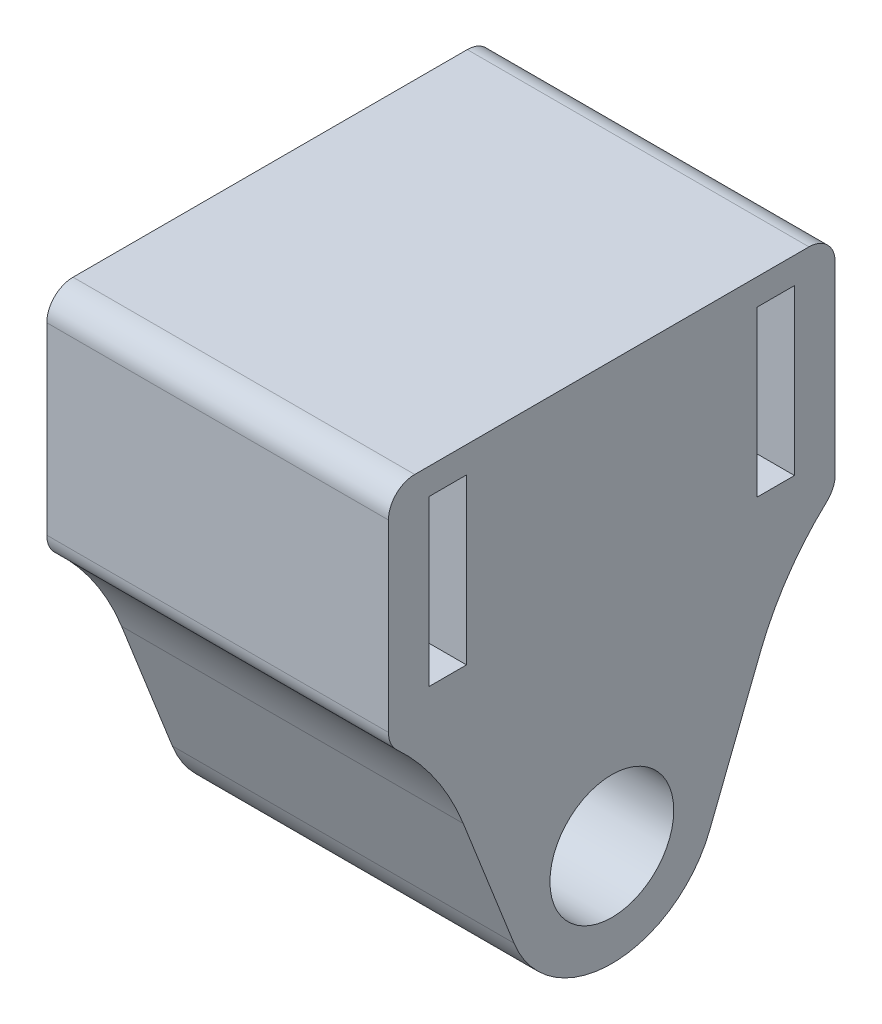
ISO-10303-21;
HEADER;
FILE_DESCRIPTION(('STEP AP214'),'2;1');
FILE_NAME('part.step','',(''),(''),'','','');
FILE_SCHEMA(('AUTOMOTIVE_DESIGN { 1 0 10303 214 1 1 1 1 }'));
ENDSEC;
DATA;
#1=APPLICATION_CONTEXT('core data for automotive mechanical design processes');
#2=APPLICATION_PROTOCOL_DEFINITION('international standard','automotive_design',2000,#1);
#3=PRODUCT_CONTEXT('',#1,'mechanical');
#4=PRODUCT('Part','Part','',(#3));
#5=PRODUCT_RELATED_PRODUCT_CATEGORY('part','',(#4));
#6=PRODUCT_DEFINITION_FORMATION('','',#4);
#7=PRODUCT_DEFINITION_CONTEXT('part definition',#1,'design');
#8=PRODUCT_DEFINITION('design','',#6,#7);
#9=PRODUCT_DEFINITION_SHAPE('','',#8);
#10=(LENGTH_UNIT() NAMED_UNIT(*) SI_UNIT(.MILLI.,.METRE.));
#11=(NAMED_UNIT(*) PLANE_ANGLE_UNIT() SI_UNIT($,.RADIAN.));
#12=(NAMED_UNIT(*) SI_UNIT($,.STERADIAN.) SOLID_ANGLE_UNIT());
#13=UNCERTAINTY_MEASURE_WITH_UNIT(LENGTH_MEASURE(1.E-05),#10,'distance_accuracy_value','');
#14=(GEOMETRIC_REPRESENTATION_CONTEXT(3) GLOBAL_UNCERTAINTY_ASSIGNED_CONTEXT((#13)) GLOBAL_UNIT_ASSIGNED_CONTEXT((#10,
#11,#12)) REPRESENTATION_CONTEXT('',''));
#15=CARTESIAN_POINT('',(0.,0.,0.));
#16=DIRECTION('',(0.,0.,1.));
#17=DIRECTION('',(1.,0.,0.));
#18=AXIS2_PLACEMENT_3D('',#15,#16,#17);
#19=CARTESIAN_POINT('',(-13.,7.935,8.5));
#20=DIRECTION('',(0.,0.,1.));
#21=DIRECTION('',(0.,-1.,0.));
#22=AXIS2_PLACEMENT_3D('',#19,#20,#21);
#23=PLANE('',#22);
#24=DIRECTION('',(0.,-1.,0.));
#25=VECTOR('',#24,1.);
#26=CARTESIAN_POINT('',(-13.,7.935,8.5));
#27=LINE('',#26,#25);
#28=CARTESIAN_POINT('',(-13.,6.935,8.5));
#29=VERTEX_POINT('',#28);
#30=CARTESIAN_POINT('',(-13.,-0.0649999999999956,8.5));
#31=VERTEX_POINT('',#30);
#32=EDGE_CURVE('E222',#29,#31,#27,.T.);
#33=ORIENTED_EDGE('',*,*,#32,.T.);
#34=DIRECTION('',(1.,0.,0.));
#35=VECTOR('',#34,1.);
#36=CARTESIAN_POINT('',(-13.,-0.0649999999999956,8.5));
#37=LINE('',#36,#35);
#38=CARTESIAN_POINT('',(0.,-0.0649999999999956,8.5));
#39=VERTEX_POINT('',#38);
#40=EDGE_CURVE('E285',#31,#39,#37,.T.);
#41=ORIENTED_EDGE('',*,*,#40,.T.);
#42=DIRECTION('',(0.,-1.,0.));
#43=VECTOR('',#42,1.);
#44=CARTESIAN_POINT('',(0.,7.935,8.5));
#45=LINE('',#44,#43);
#46=CARTESIAN_POINT('',(0.,6.935,8.5));
#47=VERTEX_POINT('',#46);
#48=EDGE_CURVE('E215',#47,#39,#45,.T.);
#49=ORIENTED_EDGE('',*,*,#48,.F.);
#50=DIRECTION('',(1.,0.,0.));
#51=VECTOR('',#50,1.);
#52=CARTESIAN_POINT('',(-13.,6.935,8.5));
#53=LINE('',#52,#51);
#54=EDGE_CURVE('E283',#47,#29,#53,.F.);
#55=ORIENTED_EDGE('',*,*,#54,.T.);
#56=EDGE_LOOP('',(#33,#41,#49,#55));
#57=FACE_BOUND('',#56,.T.);
#58=ADVANCED_FACE('F36',(#57),#23,.T.);
#59=CARTESIAN_POINT('',(-13.,7.935,8.5));
#60=DIRECTION('',(0.,1.,0.));
#61=DIRECTION('',(0.,0.,1.));
#62=AXIS2_PLACEMENT_3D('',#59,#60,#61);
#63=PLANE('',#62);
#64=DIRECTION('',(0.,0.,1.));
#65=VECTOR('',#64,1.);
#66=CARTESIAN_POINT('',(0.,7.935,8.5));
#67=LINE('',#66,#65);
#68=CARTESIAN_POINT('',(0.,7.935,-7.5));
#69=VERTEX_POINT('',#68);
#70=CARTESIAN_POINT('',(0.,7.935,7.5));
#71=VERTEX_POINT('',#70);
#72=EDGE_CURVE('E226',#69,#71,#67,.T.);
#73=ORIENTED_EDGE('',*,*,#72,.F.);
#74=DIRECTION('',(1.,0.,0.));
#75=VECTOR('',#74,1.);
#76=CARTESIAN_POINT('',(-13.,7.935,-7.5));
#77=LINE('',#76,#75);
#78=CARTESIAN_POINT('',(-13.,7.935,-7.5));
#79=VERTEX_POINT('',#78);
#80=EDGE_CURVE('E291',#69,#79,#77,.F.);
#81=ORIENTED_EDGE('',*,*,#80,.T.);
#82=DIRECTION('',(0.,0.,1.));
#83=VECTOR('',#82,1.);
#84=CARTESIAN_POINT('',(-13.,7.935,8.5));
#85=LINE('',#84,#83);
#86=CARTESIAN_POINT('',(-13.,7.935,7.5));
#87=VERTEX_POINT('',#86);
#88=EDGE_CURVE('E237',#79,#87,#85,.T.);
#89=ORIENTED_EDGE('',*,*,#88,.T.);
#90=DIRECTION('',(1.,0.,0.));
#91=VECTOR('',#90,1.);
#92=CARTESIAN_POINT('',(-13.,7.935,7.5));
#93=LINE('',#92,#91);
#94=EDGE_CURVE('E288',#87,#71,#93,.T.);
#95=ORIENTED_EDGE('',*,*,#94,.T.);
#96=EDGE_LOOP('',(#73,#81,#89,#95));
#97=FACE_BOUND('',#96,.T.);
#98=ADVANCED_FACE('F355',(#97),#63,.T.);
#99=CARTESIAN_POINT('',(-13.,7.935,-8.5));
#100=DIRECTION('',(0.,0.,-1.));
#101=DIRECTION('',(0.,1.,0.));
#102=AXIS2_PLACEMENT_3D('',#99,#100,#101);
#103=PLANE('',#102);
#104=DIRECTION('',(0.,1.,0.));
#105=VECTOR('',#104,1.);
#106=CARTESIAN_POINT('',(0.,7.935,-8.5));
#107=LINE('',#106,#105);
#108=CARTESIAN_POINT('',(0.,-0.0649999999999939,-8.5));
#109=VERTEX_POINT('',#108);
#110=CARTESIAN_POINT('',(0.,6.935,-8.5));
#111=VERTEX_POINT('',#110);
#112=EDGE_CURVE('E251',#109,#111,#107,.T.);
#113=ORIENTED_EDGE('',*,*,#112,.F.);
#114=DIRECTION('',(1.,0.,0.));
#115=VECTOR('',#114,1.);
#116=CARTESIAN_POINT('',(-13.,-0.0649999999999939,-8.5));
#117=LINE('',#116,#115);
#118=CARTESIAN_POINT('',(-13.,-0.0649999999999939,-8.5));
#119=VERTEX_POINT('',#118);
#120=EDGE_CURVE('E272',#109,#119,#117,.F.);
#121=ORIENTED_EDGE('',*,*,#120,.T.);
#122=DIRECTION('',(0.,1.,0.));
#123=VECTOR('',#122,1.);
#124=CARTESIAN_POINT('',(-13.,7.935,-8.5));
#125=LINE('',#124,#123);
#126=CARTESIAN_POINT('',(-13.,6.935,-8.5));
#127=VERTEX_POINT('',#126);
#128=EDGE_CURVE('E234',#119,#127,#125,.T.);
#129=ORIENTED_EDGE('',*,*,#128,.T.);
#130=DIRECTION('',(1.,0.,0.));
#131=VECTOR('',#130,1.);
#132=CARTESIAN_POINT('',(-13.,6.935,-8.5));
#133=LINE('',#132,#131);
#134=EDGE_CURVE('E269',#127,#111,#133,.T.);
#135=ORIENTED_EDGE('',*,*,#134,.T.);
#136=EDGE_LOOP('',(#113,#121,#129,#135));
#137=FACE_BOUND('',#136,.T.);
#138=ADVANCED_FACE('F361',(#137),#103,.T.);
#139=CARTESIAN_POINT('',(-13.,-9.3989517627357,-3.72247837285632));
#140=DIRECTION('',(0.,-0.365987940683924,-0.93061959321408));
#141=DIRECTION('',(0.,0.93061959321408,-0.365987940683924));
#142=AXIS2_PLACEMENT_3D('',#139,#140,#141);
#143=PLANE('',#142);
#144=DIRECTION('',(0.,0.93061959321408,-0.365987940683924));
#145=VECTOR('',#144,1.);
#146=CARTESIAN_POINT('',(-13.,-9.3989517627357,-3.72247837285632));
#147=LINE('',#146,#145);
#148=CARTESIAN_POINT('',(-13.,-9.3989517627357,-3.72247837285632));
#149=VERTEX_POINT('',#148);
#150=CARTESIAN_POINT('',(-13.,-4.489470555018,-5.6532467879435));
#151=VERTEX_POINT('',#150);
#152=EDGE_CURVE('E231',#149,#151,#147,.T.);
#153=ORIENTED_EDGE('',*,*,#152,.T.);
#154=DIRECTION('',(-1.,0.,0.));
#155=VECTOR('',#154,1.);
#156=CARTESIAN_POINT('',(0.,-4.489470555018,-5.6532467879435));
#157=LINE('',#156,#155);
#158=CARTESIAN_POINT('',(0.,-4.489470555018,-5.6532467879435));
#159=VERTEX_POINT('',#158);
#160=EDGE_CURVE('E293',#151,#159,#157,.F.);
#161=ORIENTED_EDGE('',*,*,#160,.T.);
#162=DIRECTION('',(0.,0.93061959321408,-0.365987940683924));
#163=VECTOR('',#162,1.);
#164=CARTESIAN_POINT('',(0.,-9.3989517627357,-3.72247837285632));
#165=LINE('',#164,#163);
#166=CARTESIAN_POINT('',(0.,-9.3989517627357,-3.72247837285632));
#167=VERTEX_POINT('',#166);
#168=EDGE_CURVE('E248',#167,#159,#165,.T.);
#169=ORIENTED_EDGE('',*,*,#168,.F.);
#170=DIRECTION('',(1.,0.,0.));
#171=VECTOR('',#170,1.);
#172=CARTESIAN_POINT('',(-13.,-9.3989517627357,-3.72247837285632));
#173=LINE('',#172,#171);
#174=EDGE_CURVE('E256',#149,#167,#173,.T.);
#175=ORIENTED_EDGE('',*,*,#174,.F.);
#176=EDGE_LOOP('',(#153,#161,#169,#175));
#177=FACE_BOUND('',#176,.T.);
#178=ADVANCED_FACE('F397',(#177),#143,.T.);
#179=CARTESIAN_POINT('',(-13.,-7.935,0.));
#180=DIRECTION('',(1.,0.,0.));
#181=DIRECTION('',(0.,0.,-1.));
#182=AXIS2_PLACEMENT_3D('',#179,#180,#181);
#183=CYLINDRICAL_SURFACE('',#182,4.);
#184=CARTESIAN_POINT('',(0.,-7.935,0.));
#185=DIRECTION('',(1.,0.,0.));
#186=DIRECTION('',(0.,0.,-1.));
#187=AXIS2_PLACEMENT_3D('',#184,#185,#186);
#188=CIRCLE('',#187,4.);
#189=CARTESIAN_POINT('',(0.,-9.3989517627357,3.72247837285632));
#190=VERTEX_POINT('',#189);
#191=EDGE_CURVE('E245',#190,#167,#188,.T.);
#192=ORIENTED_EDGE('',*,*,#191,.F.);
#193=DIRECTION('',(1.,0.,0.));
#194=VECTOR('',#193,1.);
#195=CARTESIAN_POINT('',(-13.,-9.3989517627357,3.72247837285632));
#196=LINE('',#195,#194);
#197=CARTESIAN_POINT('',(-13.,-9.3989517627357,3.72247837285632));
#198=VERTEX_POINT('',#197);
#199=EDGE_CURVE('E240',#198,#190,#196,.T.);
#200=ORIENTED_EDGE('',*,*,#199,.F.);
#201=CARTESIAN_POINT('',(-13.,-7.935,0.));
#202=DIRECTION('',(1.,0.,0.));
#203=DIRECTION('',(0.,0.,-1.));
#204=AXIS2_PLACEMENT_3D('',#201,#202,#203);
#205=CIRCLE('',#204,4.);
#206=EDGE_CURVE('E228',#198,#149,#205,.T.);
#207=ORIENTED_EDGE('',*,*,#206,.T.);
#208=ORIENTED_EDGE('',*,*,#174,.T.);
#209=EDGE_LOOP('',(#192,#200,#207,#208));
#210=FACE_BOUND('',#209,.T.);
#211=ADVANCED_FACE('F350',(#210),#183,.T.);
#212=CARTESIAN_POINT('',(-13.,-9.3989517627357,3.72247837285632));
#213=DIRECTION('',(0.,-0.365987940683924,0.93061959321408));
#214=DIRECTION('',(0.,-0.93061959321408,-0.365987940683925));
#215=AXIS2_PLACEMENT_3D('',#212,#213,#214);
#216=PLANE('',#215);
#217=DIRECTION('',(0.,-0.93061959321408,-0.365987940683924));
#218=VECTOR('',#217,1.);
#219=CARTESIAN_POINT('',(0.,-9.3989517627357,3.72247837285632));
#220=LINE('',#219,#218);
#221=CARTESIAN_POINT('',(0.,-4.48947055501801,5.6532467879435));
#222=VERTEX_POINT('',#221);
#223=EDGE_CURVE('E243',#222,#190,#220,.T.);
#224=ORIENTED_EDGE('',*,*,#223,.F.);
#225=DIRECTION('',(-1.,0.,0.));
#226=VECTOR('',#225,1.);
#227=CARTESIAN_POINT('',(-13.,-4.489470555018,5.6532467879435));
#228=LINE('',#227,#226);
#229=CARTESIAN_POINT('',(-13.,-4.48947055501801,5.6532467879435));
#230=VERTEX_POINT('',#229);
#231=EDGE_CURVE('E301',#222,#230,#228,.T.);
#232=ORIENTED_EDGE('',*,*,#231,.T.);
#233=DIRECTION('',(0.,-0.93061959321408,-0.365987940683924));
#234=VECTOR('',#233,1.);
#235=CARTESIAN_POINT('',(-13.,-9.3989517627357,3.72247837285632));
#236=LINE('',#235,#234);
#237=EDGE_CURVE('E225',#230,#198,#236,.T.);
#238=ORIENTED_EDGE('',*,*,#237,.T.);
#239=ORIENTED_EDGE('',*,*,#199,.T.);
#240=EDGE_LOOP('',(#224,#232,#238,#239));
#241=FACE_BOUND('',#240,.T.);
#242=ADVANCED_FACE('F341',(#241),#216,.T.);
#243=CARTESIAN_POINT('',(-13.,-7.935,0.));
#244=DIRECTION('',(1.,0.,0.));
#245=DIRECTION('',(0.,0.,-1.));
#246=AXIS2_PLACEMENT_3D('',#243,#244,#245);
#247=PLANE('',#246);
#248=CARTESIAN_POINT('',(-13.,-8.05999999999999,0.));
#249=DIRECTION('',(-1.,0.,0.));
#250=DIRECTION('',(0.,0.,1.));
#251=AXIS2_PLACEMENT_3D('',#248,#249,#250);
#252=CIRCLE('',#251,2.355);
#253=CARTESIAN_POINT('',(-13.,-8.05999999999999,2.355));
#254=VERTEX_POINT('',#253);
#255=EDGE_CURVE('E333',#254,#254,#252,.T.);
#256=ORIENTED_EDGE('',*,*,#255,.F.);
#257=EDGE_LOOP('',(#256));
#258=FACE_BOUND('',#257,.T.);
#259=DIRECTION('',(0.,0.,-1.));
#260=VECTOR('',#259,1.);
#261=CARTESIAN_POINT('',(-13.,6.93500000000001,-6.95));
#262=LINE('',#261,#260);
#263=CARTESIAN_POINT('',(-13.,6.93500000000001,-5.53));
#264=VERTEX_POINT('',#263);
#265=CARTESIAN_POINT('',(-13.,6.93500000000001,-6.95));
#266=VERTEX_POINT('',#265);
#267=EDGE_CURVE('E185',#264,#266,#262,.T.);
#268=ORIENTED_EDGE('',*,*,#267,.F.);
#269=DIRECTION('',(0.,1.,0.));
#270=VECTOR('',#269,1.);
#271=CARTESIAN_POINT('',(-13.,6.93500000000001,-5.53));
#272=LINE('',#271,#270);
#273=CARTESIAN_POINT('',(-13.,0.675000000000007,-5.53));
#274=VERTEX_POINT('',#273);
#275=EDGE_CURVE('E52',#274,#264,#272,.T.);
#276=ORIENTED_EDGE('',*,*,#275,.F.);
#277=DIRECTION('',(0.,0.,1.));
#278=VECTOR('',#277,1.);
#279=CARTESIAN_POINT('',(-13.,0.675000000000008,-6.95));
#280=LINE('',#279,#278);
#281=CARTESIAN_POINT('',(-13.,0.675000000000008,-6.95));
#282=VERTEX_POINT('',#281);
#283=EDGE_CURVE('E192',#282,#274,#280,.T.);
#284=ORIENTED_EDGE('',*,*,#283,.F.);
#285=DIRECTION('',(0.,-1.,0.));
#286=VECTOR('',#285,1.);
#287=CARTESIAN_POINT('',(-13.,6.93500000000001,-6.95));
#288=LINE('',#287,#286);
#289=EDGE_CURVE('E176',#266,#282,#288,.T.);
#290=ORIENTED_EDGE('',*,*,#289,.F.);
#291=EDGE_LOOP('',(#268,#276,#284,#290));
#292=FACE_BOUND('',#291,.T.);
#293=DIRECTION('',(0.,0.,-1.));
#294=VECTOR('',#293,1.);
#295=CARTESIAN_POINT('',(-13.,6.93500000000001,5.53));
#296=LINE('',#295,#294);
#297=CARTESIAN_POINT('',(-13.,6.93500000000001,6.95));
#298=VERTEX_POINT('',#297);
#299=CARTESIAN_POINT('',(-13.,6.93500000000001,5.53));
#300=VERTEX_POINT('',#299);
#301=EDGE_CURVE('E203',#298,#300,#296,.T.);
#302=ORIENTED_EDGE('',*,*,#301,.F.);
#303=DIRECTION('',(0.,1.,0.));
#304=VECTOR('',#303,1.);
#305=CARTESIAN_POINT('',(-13.,0.675000000000007,6.95));
#306=LINE('',#305,#304);
#307=CARTESIAN_POINT('',(-13.,0.675000000000007,6.95));
#308=VERTEX_POINT('',#307);
#309=EDGE_CURVE('E199',#308,#298,#306,.T.);
#310=ORIENTED_EDGE('',*,*,#309,.F.);
#311=DIRECTION('',(0.,0.,1.));
#312=VECTOR('',#311,1.);
#313=CARTESIAN_POINT('',(-13.,0.675000000000007,5.53));
#314=LINE('',#313,#312);
#315=CARTESIAN_POINT('',(-13.,0.675000000000007,5.53));
#316=VERTEX_POINT('',#315);
#317=EDGE_CURVE('E209',#316,#308,#314,.T.);
#318=ORIENTED_EDGE('',*,*,#317,.F.);
#319=DIRECTION('',(0.,-1.,0.));
#320=VECTOR('',#319,1.);
#321=CARTESIAN_POINT('',(-13.,0.675000000000007,5.53));
#322=LINE('',#321,#320);
#323=EDGE_CURVE('E206',#300,#316,#322,.T.);
#324=ORIENTED_EDGE('',*,*,#323,.F.);
#325=EDGE_LOOP('',(#302,#310,#318,#324));
#326=FACE_BOUND('',#325,.T.);
#327=ORIENTED_EDGE('',*,*,#128,.F.);
#328=CARTESIAN_POINT('',(-13.,-0.0649999999999938,-7.5));
#329=DIRECTION('',(1.,0.,0.));
#330=DIRECTION('',(0.,0.,-1.));
#331=AXIS2_PLACEMENT_3D('',#328,#329,#330);
#332=CIRCLE('',#331,1.);
#333=CARTESIAN_POINT('',(-13.,-0.79994090562338,-8.1781311563713));
#334=VERTEX_POINT('',#333);
#335=EDGE_CURVE('E280',#119,#334,#332,.F.);
#336=ORIENTED_EDGE('',*,*,#335,.T.);
#337=CARTESIAN_POINT('',(-13.,-8.14934996185724,-14.9594427200843));
#338=DIRECTION('',(1.,0.,0.));
#339=DIRECTION('',(0.,0.,-1.));
#340=AXIS2_PLACEMENT_3D('',#337,#338,#339);
#341=CIRCLE('',#340,10.);
#342=EDGE_CURVE('E305',#334,#151,#341,.T.);
#343=ORIENTED_EDGE('',*,*,#342,.T.);
#344=ORIENTED_EDGE('',*,*,#152,.F.);
#345=ORIENTED_EDGE('',*,*,#206,.F.);
#346=ORIENTED_EDGE('',*,*,#237,.F.);
#347=CARTESIAN_POINT('',(-13.,-8.14934996185725,14.9594427200843));
#348=DIRECTION('',(1.,0.,0.));
#349=DIRECTION('',(0.,0.,-1.));
#350=AXIS2_PLACEMENT_3D('',#347,#348,#349);
#351=CIRCLE('',#350,10.);
#352=CARTESIAN_POINT('',(-13.,-0.799940905623382,8.1781311563713));
#353=VERTEX_POINT('',#352);
#354=EDGE_CURVE('E309',#230,#353,#351,.T.);
#355=ORIENTED_EDGE('',*,*,#354,.T.);
#356=CARTESIAN_POINT('',(-13.,-0.0649999999999956,7.5));
#357=DIRECTION('',(1.,0.,0.));
#358=DIRECTION('',(0.,0.,-1.));
#359=AXIS2_PLACEMENT_3D('',#356,#357,#358);
#360=CIRCLE('',#359,1.);
#361=EDGE_CURVE('E278',#353,#31,#360,.F.);
#362=ORIENTED_EDGE('',*,*,#361,.T.);
#363=ORIENTED_EDGE('',*,*,#32,.F.);
#364=CARTESIAN_POINT('',(-13.,6.935,7.5));
#365=DIRECTION('',(1.,0.,0.));
#366=DIRECTION('',(0.,0.,-1.));
#367=AXIS2_PLACEMENT_3D('',#364,#365,#366);
#368=CIRCLE('',#367,1.);
#369=EDGE_CURVE('E274',#29,#87,#368,.F.);
#370=ORIENTED_EDGE('',*,*,#369,.T.);
#371=ORIENTED_EDGE('',*,*,#88,.F.);
#372=CARTESIAN_POINT('',(-13.,6.935,-7.5));
#373=DIRECTION('',(1.,0.,0.));
#374=DIRECTION('',(0.,0.,-1.));
#375=AXIS2_PLACEMENT_3D('',#372,#373,#374);
#376=CIRCLE('',#375,1.);
#377=EDGE_CURVE('E276',#79,#127,#376,.F.);
#378=ORIENTED_EDGE('',*,*,#377,.T.);
#379=EDGE_LOOP('',(#327,#336,#343,#344,#345,#346,#355,#362,#363,#370,#371,#378));
#380=FACE_BOUND('',#379,.T.);
#381=ADVANCED_FACE('F189',(#258,#292,#326,#380),#247,.F.);
#382=CARTESIAN_POINT('',(0.,-7.935,0.));
#383=DIRECTION('',(1.,0.,0.));
#384=DIRECTION('',(0.,0.,-1.));
#385=AXIS2_PLACEMENT_3D('',#382,#383,#384);
#386=PLANE('',#385);
#387=CARTESIAN_POINT('',(0.,-8.05999999999999,0.));
#388=DIRECTION('',(1.,0.,0.));
#389=DIRECTION('',(0.,0.,-1.));
#390=AXIS2_PLACEMENT_3D('',#387,#388,#389);
#391=CIRCLE('',#390,2.355);
#392=CARTESIAN_POINT('',(0.,-8.05999999999999,-2.355));
#393=VERTEX_POINT('',#392);
#394=EDGE_CURVE('E40',#393,#393,#391,.T.);
#395=ORIENTED_EDGE('',*,*,#394,.F.);
#396=EDGE_LOOP('',(#395));
#397=FACE_BOUND('',#396,.T.);
#398=DIRECTION('',(0.,-1.,0.));
#399=VECTOR('',#398,1.);
#400=CARTESIAN_POINT('',(0.,-7.935,-5.53));
#401=LINE('',#400,#399);
#402=CARTESIAN_POINT('',(0.,6.93500000000001,-5.53));
#403=VERTEX_POINT('',#402);
#404=CARTESIAN_POINT('',(0.,0.675000000000007,-5.53));
#405=VERTEX_POINT('',#404);
#406=EDGE_CURVE('E11',#403,#405,#401,.T.);
#407=ORIENTED_EDGE('',*,*,#406,.F.);
#408=DIRECTION('',(0.,0.,1.));
#409=VECTOR('',#408,1.);
#410=CARTESIAN_POINT('',(0.,6.93500000000002,0.));
#411=LINE('',#410,#409);
#412=CARTESIAN_POINT('',(0.,6.93500000000001,-6.95));
#413=VERTEX_POINT('',#412);
#414=EDGE_CURVE('E320',#413,#403,#411,.T.);
#415=ORIENTED_EDGE('',*,*,#414,.F.);
#416=DIRECTION('',(0.,1.,0.));
#417=VECTOR('',#416,1.);
#418=CARTESIAN_POINT('',(0.,-7.935,-6.95));
#419=LINE('',#418,#417);
#420=CARTESIAN_POINT('',(0.,0.675000000000008,-6.95));
#421=VERTEX_POINT('',#420);
#422=EDGE_CURVE('E179',#421,#413,#419,.T.);
#423=ORIENTED_EDGE('',*,*,#422,.F.);
#424=DIRECTION('',(0.,0.,-1.));
#425=VECTOR('',#424,1.);
#426=CARTESIAN_POINT('',(0.,0.675000000000005,0.));
#427=LINE('',#426,#425);
#428=EDGE_CURVE('E45',#405,#421,#427,.T.);
#429=ORIENTED_EDGE('',*,*,#428,.F.);
#430=EDGE_LOOP('',(#407,#415,#423,#429));
#431=FACE_BOUND('',#430,.T.);
#432=DIRECTION('',(0.,-1.,0.));
#433=VECTOR('',#432,1.);
#434=CARTESIAN_POINT('',(0.,-7.935,6.95));
#435=LINE('',#434,#433);
#436=CARTESIAN_POINT('',(0.,6.93500000000001,6.95));
#437=VERTEX_POINT('',#436);
#438=CARTESIAN_POINT('',(0.,0.675000000000007,6.95));
#439=VERTEX_POINT('',#438);
#440=EDGE_CURVE('E318',#437,#439,#435,.T.);
#441=ORIENTED_EDGE('',*,*,#440,.F.);
#442=DIRECTION('',(0.,0.,1.));
#443=VECTOR('',#442,1.);
#444=CARTESIAN_POINT('',(0.,6.93500000000001,0.));
#445=LINE('',#444,#443);
#446=CARTESIAN_POINT('',(0.,6.93500000000001,5.53));
#447=VERTEX_POINT('',#446);
#448=EDGE_CURVE('E311',#447,#437,#445,.T.);
#449=ORIENTED_EDGE('',*,*,#448,.F.);
#450=DIRECTION('',(0.,1.,0.));
#451=VECTOR('',#450,1.);
#452=CARTESIAN_POINT('',(0.,-7.935,5.53));
#453=LINE('',#452,#451);
#454=CARTESIAN_POINT('',(0.,0.675000000000007,5.53));
#455=VERTEX_POINT('',#454);
#456=EDGE_CURVE('E313',#455,#447,#453,.T.);
#457=ORIENTED_EDGE('',*,*,#456,.F.);
#458=DIRECTION('',(0.,0.,-1.));
#459=VECTOR('',#458,1.);
#460=CARTESIAN_POINT('',(0.,0.675000000000007,0.));
#461=LINE('',#460,#459);
#462=EDGE_CURVE('E316',#439,#455,#461,.T.);
#463=ORIENTED_EDGE('',*,*,#462,.F.);
#464=EDGE_LOOP('',(#441,#449,#457,#463));
#465=FACE_BOUND('',#464,.T.);
#466=ORIENTED_EDGE('',*,*,#168,.T.);
#467=CARTESIAN_POINT('',(0.,-8.14934996185724,-14.9594427200843));
#468=DIRECTION('',(1.,0.,0.));
#469=DIRECTION('',(0.,0.,-1.));
#470=AXIS2_PLACEMENT_3D('',#467,#468,#469);
#471=CIRCLE('',#470,10.);
#472=CARTESIAN_POINT('',(0.,-0.79994090562338,-8.1781311563713));
#473=VERTEX_POINT('',#472);
#474=EDGE_CURVE('E303',#159,#473,#471,.F.);
#475=ORIENTED_EDGE('',*,*,#474,.T.);
#476=CARTESIAN_POINT('',(0.,-0.0649999999999938,-7.5));
#477=DIRECTION('',(1.,0.,0.));
#478=DIRECTION('',(0.,0.,-1.));
#479=AXIS2_PLACEMENT_3D('',#476,#477,#478);
#480=CIRCLE('',#479,1.);
#481=EDGE_CURVE('E267',#473,#109,#480,.T.);
#482=ORIENTED_EDGE('',*,*,#481,.T.);
#483=ORIENTED_EDGE('',*,*,#112,.T.);
#484=CARTESIAN_POINT('',(0.,6.935,-7.5));
#485=DIRECTION('',(1.,0.,0.));
#486=DIRECTION('',(0.,0.,-1.));
#487=AXIS2_PLACEMENT_3D('',#484,#485,#486);
#488=CIRCLE('',#487,1.);
#489=EDGE_CURVE('E262',#111,#69,#488,.T.);
#490=ORIENTED_EDGE('',*,*,#489,.T.);
#491=ORIENTED_EDGE('',*,*,#72,.T.);
#492=CARTESIAN_POINT('',(0.,6.935,7.5));
#493=DIRECTION('',(1.,0.,0.));
#494=DIRECTION('',(0.,0.,-1.));
#495=AXIS2_PLACEMENT_3D('',#492,#493,#494);
#496=CIRCLE('',#495,1.);
#497=EDGE_CURVE('E258',#71,#47,#496,.T.);
#498=ORIENTED_EDGE('',*,*,#497,.T.);
#499=ORIENTED_EDGE('',*,*,#48,.T.);
#500=CARTESIAN_POINT('',(0.,-0.0649999999999956,7.5));
#501=DIRECTION('',(1.,0.,0.));
#502=DIRECTION('',(0.,0.,-1.));
#503=AXIS2_PLACEMENT_3D('',#500,#501,#502);
#504=CIRCLE('',#503,1.);
#505=CARTESIAN_POINT('',(0.,-0.799940905623382,8.1781311563713));
#506=VERTEX_POINT('',#505);
#507=EDGE_CURVE('E264',#39,#506,#504,.T.);
#508=ORIENTED_EDGE('',*,*,#507,.T.);
#509=CARTESIAN_POINT('',(0.,-8.14934996185725,14.9594427200843));
#510=DIRECTION('',(1.,0.,0.));
#511=DIRECTION('',(0.,0.,-1.));
#512=AXIS2_PLACEMENT_3D('',#509,#510,#511);
#513=CIRCLE('',#512,10.);
#514=EDGE_CURVE('E307',#506,#222,#513,.F.);
#515=ORIENTED_EDGE('',*,*,#514,.T.);
#516=ORIENTED_EDGE('',*,*,#223,.T.);
#517=ORIENTED_EDGE('',*,*,#191,.T.);
#518=EDGE_LOOP('',(#466,#475,#482,#483,#490,#491,#498,#499,#508,#515,#516,#517));
#519=FACE_BOUND('',#518,.T.);
#520=ADVANCED_FACE('F329',(#397,#431,#465,#519),#386,.T.);
#521=CARTESIAN_POINT('',(-13.,-0.0649999999999938,-7.5));
#522=DIRECTION('',(1.,0.,0.));
#523=DIRECTION('',(0.,0.,-1.));
#524=AXIS2_PLACEMENT_3D('',#521,#522,#523);
#525=CYLINDRICAL_SURFACE('',#524,1.);
#526=ORIENTED_EDGE('',*,*,#481,.F.);
#527=DIRECTION('',(1.,0.,0.));
#528=VECTOR('',#527,1.);
#529=CARTESIAN_POINT('',(-13.,-0.79994090562338,-8.1781311563713));
#530=LINE('',#529,#528);
#531=EDGE_CURVE('E296',#473,#334,#530,.F.);
#532=ORIENTED_EDGE('',*,*,#531,.T.);
#533=ORIENTED_EDGE('',*,*,#335,.F.);
#534=ORIENTED_EDGE('',*,*,#120,.F.);
#535=EDGE_LOOP('',(#526,#532,#533,#534));
#536=FACE_BOUND('',#535,.T.);
#537=ADVANCED_FACE('F347',(#536),#525,.T.);
#538=CARTESIAN_POINT('',(-13.,-0.0649999999999956,7.5));
#539=DIRECTION('',(1.,0.,0.));
#540=DIRECTION('',(0.,0.,-1.));
#541=AXIS2_PLACEMENT_3D('',#538,#539,#540);
#542=CYLINDRICAL_SURFACE('',#541,1.);
#543=ORIENTED_EDGE('',*,*,#361,.F.);
#544=DIRECTION('',(1.,0.,0.));
#545=VECTOR('',#544,1.);
#546=CARTESIAN_POINT('',(-13.,-0.799940905623382,8.1781311563713));
#547=LINE('',#546,#545);
#548=EDGE_CURVE('E298',#353,#506,#547,.T.);
#549=ORIENTED_EDGE('',*,*,#548,.T.);
#550=ORIENTED_EDGE('',*,*,#507,.F.);
#551=ORIENTED_EDGE('',*,*,#40,.F.);
#552=EDGE_LOOP('',(#543,#549,#550,#551));
#553=FACE_BOUND('',#552,.T.);
#554=ADVANCED_FACE('F368',(#553),#542,.T.);
#555=CARTESIAN_POINT('',(-13.,6.935,-7.5));
#556=DIRECTION('',(1.,0.,0.));
#557=DIRECTION('',(0.,0.,-1.));
#558=AXIS2_PLACEMENT_3D('',#555,#556,#557);
#559=CYLINDRICAL_SURFACE('',#558,1.);
#560=ORIENTED_EDGE('',*,*,#377,.F.);
#561=ORIENTED_EDGE('',*,*,#80,.F.);
#562=ORIENTED_EDGE('',*,*,#489,.F.);
#563=ORIENTED_EDGE('',*,*,#134,.F.);
#564=EDGE_LOOP('',(#560,#561,#562,#563));
#565=FACE_BOUND('',#564,.T.);
#566=ADVANCED_FACE('F372',(#565),#559,.T.);
#567=CARTESIAN_POINT('',(-13.,6.935,7.5));
#568=DIRECTION('',(1.,0.,0.));
#569=DIRECTION('',(0.,0.,-1.));
#570=AXIS2_PLACEMENT_3D('',#567,#568,#569);
#571=CYLINDRICAL_SURFACE('',#570,1.);
#572=ORIENTED_EDGE('',*,*,#369,.F.);
#573=ORIENTED_EDGE('',*,*,#54,.F.);
#574=ORIENTED_EDGE('',*,*,#497,.F.);
#575=ORIENTED_EDGE('',*,*,#94,.F.);
#576=EDGE_LOOP('',(#572,#573,#574,#575));
#577=FACE_BOUND('',#576,.T.);
#578=ADVANCED_FACE('F376',(#577),#571,.T.);
#579=CARTESIAN_POINT('',(-13.,-8.14934996185724,-14.9594427200843));
#580=DIRECTION('',(1.,0.,0.));
#581=DIRECTION('',(0.,0.,-1.));
#582=AXIS2_PLACEMENT_3D('',#579,#580,#581);
#583=CYLINDRICAL_SURFACE('',#582,10.);
#584=ORIENTED_EDGE('',*,*,#342,.F.);
#585=ORIENTED_EDGE('',*,*,#531,.F.);
#586=ORIENTED_EDGE('',*,*,#474,.F.);
#587=ORIENTED_EDGE('',*,*,#160,.F.);
#588=EDGE_LOOP('',(#584,#585,#586,#587));
#589=FACE_BOUND('',#588,.T.);
#590=ADVANCED_FACE('F379',(#589),#583,.F.);
#591=CARTESIAN_POINT('',(-13.,-8.14934996185725,14.9594427200843));
#592=DIRECTION('',(1.,0.,0.));
#593=DIRECTION('',(0.,0.,-1.));
#594=AXIS2_PLACEMENT_3D('',#591,#592,#593);
#595=CYLINDRICAL_SURFACE('',#594,10.);
#596=ORIENTED_EDGE('',*,*,#354,.F.);
#597=ORIENTED_EDGE('',*,*,#231,.F.);
#598=ORIENTED_EDGE('',*,*,#514,.F.);
#599=ORIENTED_EDGE('',*,*,#548,.F.);
#600=EDGE_LOOP('',(#596,#597,#598,#599));
#601=FACE_BOUND('',#600,.T.);
#602=ADVANCED_FACE('F38',(#601),#595,.F.);
#603=CARTESIAN_POINT('',(5.,0.675000000000007,6.95));
#604=DIRECTION('',(0.,0.,1.));
#605=DIRECTION('',(0.,-1.,0.));
#606=AXIS2_PLACEMENT_3D('',#603,#604,#605);
#607=PLANE('',#606);
#608=ORIENTED_EDGE('',*,*,#440,.T.);
#609=DIRECTION('',(-1.,0.,0.));
#610=VECTOR('',#609,1.);
#611=CARTESIAN_POINT('',(5.,0.675000000000007,6.95));
#612=LINE('',#611,#610);
#613=EDGE_CURVE('E213',#439,#308,#612,.T.);
#614=ORIENTED_EDGE('',*,*,#613,.T.);
#615=ORIENTED_EDGE('',*,*,#309,.T.);
#616=DIRECTION('',(-1.,0.,0.));
#617=VECTOR('',#616,1.);
#618=CARTESIAN_POINT('',(5.,6.93500000000001,6.95));
#619=LINE('',#618,#617);
#620=EDGE_CURVE('E212',#437,#298,#619,.T.);
#621=ORIENTED_EDGE('',*,*,#620,.F.);
#622=EDGE_LOOP('',(#608,#614,#615,#621));
#623=FACE_BOUND('',#622,.T.);
#624=ADVANCED_FACE('F386',(#623),#607,.F.);
#625=CARTESIAN_POINT('',(5.,0.675000000000007,5.53));
#626=DIRECTION('',(0.,-1.,0.));
#627=DIRECTION('',(0.,0.,-1.));
#628=AXIS2_PLACEMENT_3D('',#625,#626,#627);
#629=PLANE('',#628);
#630=ORIENTED_EDGE('',*,*,#462,.T.);
#631=DIRECTION('',(-1.,0.,0.));
#632=VECTOR('',#631,1.);
#633=CARTESIAN_POINT('',(5.,0.675000000000007,5.53));
#634=LINE('',#633,#632);
#635=EDGE_CURVE('E216',#455,#316,#634,.T.);
#636=ORIENTED_EDGE('',*,*,#635,.T.);
#637=ORIENTED_EDGE('',*,*,#317,.T.);
#638=ORIENTED_EDGE('',*,*,#613,.F.);
#639=EDGE_LOOP('',(#630,#636,#637,#638));
#640=FACE_BOUND('',#639,.T.);
#641=ADVANCED_FACE('F485',(#640),#629,.F.);
#642=CARTESIAN_POINT('',(5.,0.675000000000007,5.53));
#643=DIRECTION('',(0.,0.,-1.));
#644=DIRECTION('',(0.,1.,0.));
#645=AXIS2_PLACEMENT_3D('',#642,#643,#644);
#646=PLANE('',#645);
#647=ORIENTED_EDGE('',*,*,#456,.T.);
#648=DIRECTION('',(-1.,0.,0.));
#649=VECTOR('',#648,1.);
#650=CARTESIAN_POINT('',(5.,6.93500000000001,5.53));
#651=LINE('',#650,#649);
#652=EDGE_CURVE('E218',#447,#300,#651,.T.);
#653=ORIENTED_EDGE('',*,*,#652,.T.);
#654=ORIENTED_EDGE('',*,*,#323,.T.);
#655=ORIENTED_EDGE('',*,*,#635,.F.);
#656=EDGE_LOOP('',(#647,#653,#654,#655));
#657=FACE_BOUND('',#656,.T.);
#658=ADVANCED_FACE('F494',(#657),#646,.F.);
#659=CARTESIAN_POINT('',(5.,6.93500000000001,5.53));
#660=DIRECTION('',(0.,1.,0.));
#661=DIRECTION('',(0.,0.,1.));
#662=AXIS2_PLACEMENT_3D('',#659,#660,#661);
#663=PLANE('',#662);
#664=ORIENTED_EDGE('',*,*,#448,.T.);
#665=ORIENTED_EDGE('',*,*,#620,.T.);
#666=ORIENTED_EDGE('',*,*,#301,.T.);
#667=ORIENTED_EDGE('',*,*,#652,.F.);
#668=EDGE_LOOP('',(#664,#665,#666,#667));
#669=FACE_BOUND('',#668,.T.);
#670=ADVANCED_FACE('F504',(#669),#663,.F.);
#671=CARTESIAN_POINT('',(5.,6.93500000000001,-5.53));
#672=DIRECTION('',(0.,0.,1.));
#673=DIRECTION('',(0.,-1.,0.));
#674=AXIS2_PLACEMENT_3D('',#671,#672,#673);
#675=PLANE('',#674);
#676=ORIENTED_EDGE('',*,*,#406,.T.);
#677=DIRECTION('',(-1.,0.,0.));
#678=VECTOR('',#677,1.);
#679=CARTESIAN_POINT('',(5.,0.675000000000007,-5.53));
#680=LINE('',#679,#678);
#681=EDGE_CURVE('E197',#405,#274,#680,.T.);
#682=ORIENTED_EDGE('',*,*,#681,.T.);
#683=ORIENTED_EDGE('',*,*,#275,.T.);
#684=DIRECTION('',(-1.,0.,0.));
#685=VECTOR('',#684,1.);
#686=CARTESIAN_POINT('',(5.,6.93500000000001,-5.53));
#687=LINE('',#686,#685);
#688=EDGE_CURVE('E182',#403,#264,#687,.T.);
#689=ORIENTED_EDGE('',*,*,#688,.F.);
#690=EDGE_LOOP('',(#676,#682,#683,#689));
#691=FACE_BOUND('',#690,.T.);
#692=ADVANCED_FACE('F331',(#691),#675,.F.);
#693=CARTESIAN_POINT('',(5.,0.675000000000008,-6.95));
#694=DIRECTION('',(0.,-1.,0.));
#695=DIRECTION('',(0.,0.,-1.));
#696=AXIS2_PLACEMENT_3D('',#693,#694,#695);
#697=PLANE('',#696);
#698=ORIENTED_EDGE('',*,*,#428,.T.);
#699=DIRECTION('',(-1.,0.,0.));
#700=VECTOR('',#699,1.);
#701=CARTESIAN_POINT('',(5.,0.675000000000008,-6.95));
#702=LINE('',#701,#700);
#703=EDGE_CURVE('E181',#421,#282,#702,.T.);
#704=ORIENTED_EDGE('',*,*,#703,.T.);
#705=ORIENTED_EDGE('',*,*,#283,.T.);
#706=ORIENTED_EDGE('',*,*,#681,.F.);
#707=EDGE_LOOP('',(#698,#704,#705,#706));
#708=FACE_BOUND('',#707,.T.);
#709=ADVANCED_FACE('F326',(#708),#697,.F.);
#710=CARTESIAN_POINT('',(5.,6.93500000000001,-6.95));
#711=DIRECTION('',(0.,0.,-1.));
#712=DIRECTION('',(0.,1.,0.));
#713=AXIS2_PLACEMENT_3D('',#710,#711,#712);
#714=PLANE('',#713);
#715=ORIENTED_EDGE('',*,*,#422,.T.);
#716=DIRECTION('',(-1.,0.,0.));
#717=VECTOR('',#716,1.);
#718=CARTESIAN_POINT('',(5.,6.93500000000001,-6.95));
#719=LINE('',#718,#717);
#720=EDGE_CURVE('E60',#413,#266,#719,.T.);
#721=ORIENTED_EDGE('',*,*,#720,.T.);
#722=ORIENTED_EDGE('',*,*,#289,.T.);
#723=ORIENTED_EDGE('',*,*,#703,.F.);
#724=EDGE_LOOP('',(#715,#721,#722,#723));
#725=FACE_BOUND('',#724,.T.);
#726=ADVANCED_FACE('F173',(#725),#714,.F.);
#727=CARTESIAN_POINT('',(5.,6.93500000000001,-6.95));
#728=DIRECTION('',(0.,1.,0.));
#729=DIRECTION('',(0.,0.,1.));
#730=AXIS2_PLACEMENT_3D('',#727,#728,#729);
#731=PLANE('',#730);
#732=ORIENTED_EDGE('',*,*,#414,.T.);
#733=ORIENTED_EDGE('',*,*,#688,.T.);
#734=ORIENTED_EDGE('',*,*,#267,.T.);
#735=ORIENTED_EDGE('',*,*,#720,.F.);
#736=EDGE_LOOP('',(#732,#733,#734,#735));
#737=FACE_BOUND('',#736,.T.);
#738=ADVANCED_FACE('F186',(#737),#731,.F.);
#739=CARTESIAN_POINT('',(5.,-8.05999999999999,0.));
#740=DIRECTION('',(-1.,0.,0.));
#741=DIRECTION('',(0.,0.,1.));
#742=AXIS2_PLACEMENT_3D('',#739,#740,#741);
#743=CYLINDRICAL_SURFACE('',#742,2.355);
#744=ORIENTED_EDGE('',*,*,#394,.T.);
#745=EDGE_LOOP('',(#744));
#746=FACE_BOUND('',#745,.T.);
#747=ORIENTED_EDGE('',*,*,#255,.T.);
#748=EDGE_LOOP('',(#747));
#749=FACE_BOUND('',#748,.T.);
#750=ADVANCED_FACE('F338',(#746,#749),#743,.F.);
#751=CLOSED_SHELL('',(#58,#98,#138,#178,#211,#242,#381,#520,#537,#554,#566,#578,#590,#602,#624,
#641,#658,#670,#692,#709,#726,#738,#750));
#752=MANIFOLD_SOLID_BREP('B2',#751);
#753=ADVANCED_BREP_SHAPE_REPRESENTATION('',(#18,#752),#14);
#754=SHAPE_DEFINITION_REPRESENTATION(#9,#753);
ENDSEC;
END-ISO-10303-21;
